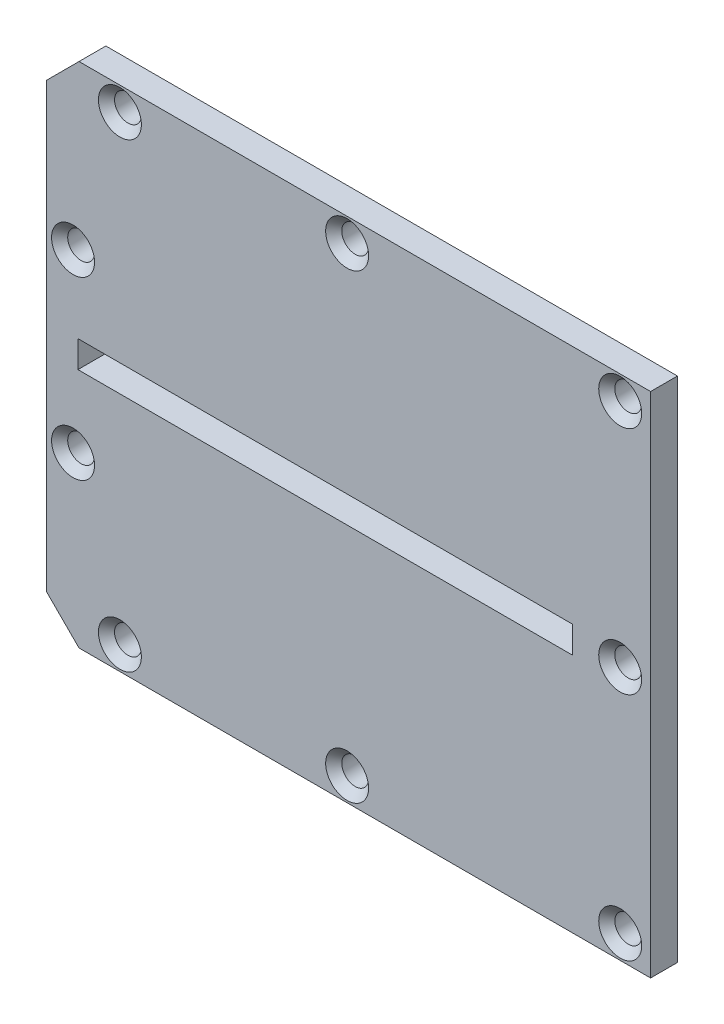
ISO-10303-21;
HEADER;
FILE_DESCRIPTION(('STEP AP214'),'2;1');
FILE_NAME('part.step','',(''),(''),'','','');
FILE_SCHEMA(('AUTOMOTIVE_DESIGN { 1 0 10303 214 1 1 1 1 }'));
ENDSEC;
DATA;
#1=APPLICATION_CONTEXT('core data for automotive mechanical design processes');
#2=APPLICATION_PROTOCOL_DEFINITION('international standard','automotive_design',2000,#1);
#3=PRODUCT_CONTEXT('',#1,'mechanical');
#4=PRODUCT('Part','Part','',(#3));
#5=PRODUCT_RELATED_PRODUCT_CATEGORY('part','',(#4));
#6=PRODUCT_DEFINITION_FORMATION('','',#4);
#7=PRODUCT_DEFINITION_CONTEXT('part definition',#1,'design');
#8=PRODUCT_DEFINITION('design','',#6,#7);
#9=PRODUCT_DEFINITION_SHAPE('','',#8);
#10=(LENGTH_UNIT() NAMED_UNIT(*) SI_UNIT(.MILLI.,.METRE.));
#11=(NAMED_UNIT(*) PLANE_ANGLE_UNIT() SI_UNIT($,.RADIAN.));
#12=(NAMED_UNIT(*) SI_UNIT($,.STERADIAN.) SOLID_ANGLE_UNIT());
#13=UNCERTAINTY_MEASURE_WITH_UNIT(LENGTH_MEASURE(1.E-05),#10,'distance_accuracy_value','');
#14=(GEOMETRIC_REPRESENTATION_CONTEXT(3) GLOBAL_UNCERTAINTY_ASSIGNED_CONTEXT((#13)) GLOBAL_UNIT_ASSIGNED_CONTEXT((#10,
#11,#12)) REPRESENTATION_CONTEXT('',''));
#15=CARTESIAN_POINT('',(0.,0.,0.));
#16=DIRECTION('',(0.,0.,1.));
#17=DIRECTION('',(1.,0.,0.));
#18=AXIS2_PLACEMENT_3D('',#15,#16,#17);
#19=CARTESIAN_POINT('',(0.,0.,2.54));
#20=DIRECTION('',(0.,0.,-1.));
#21=DIRECTION('',(-1.,0.,0.));
#22=AXIS2_PLACEMENT_3D('',#19,#20,#21);
#23=PLANE('',#22);
#24=DIRECTION('',(1.,0.,0.));
#25=VECTOR('',#24,1.);
#26=CARTESIAN_POINT('',(-104.982990789968,-1.27,2.54));
#27=LINE('',#26,#25);
#28=CARTESIAN_POINT('',(-104.982990789968,-1.27,2.54));
#29=VERTEX_POINT('',#28);
#30=CARTESIAN_POINT('',(-58.1832279844542,-1.27,2.54));
#31=VERTEX_POINT('',#30);
#32=EDGE_CURVE('E123',#29,#31,#27,.T.);
#33=ORIENTED_EDGE('',*,*,#32,.F.);
#34=DIRECTION('',(0.,-1.,0.));
#35=VECTOR('',#34,1.);
#36=CARTESIAN_POINT('',(-104.982990789968,1.27,2.54));
#37=LINE('',#36,#35);
#38=CARTESIAN_POINT('',(-104.982990789968,1.27,2.54));
#39=VERTEX_POINT('',#38);
#40=EDGE_CURVE('E50',#39,#29,#37,.T.);
#41=ORIENTED_EDGE('',*,*,#40,.F.);
#42=DIRECTION('',(-1.,0.,0.));
#43=VECTOR('',#42,1.);
#44=CARTESIAN_POINT('',(-104.982990789968,1.27,2.54));
#45=LINE('',#44,#43);
#46=CARTESIAN_POINT('',(-58.1832279844542,1.27,2.54));
#47=VERTEX_POINT('',#46);
#48=EDGE_CURVE('E129',#47,#39,#45,.T.);
#49=ORIENTED_EDGE('',*,*,#48,.F.);
#50=DIRECTION('',(0.,1.,0.));
#51=VECTOR('',#50,1.);
#52=CARTESIAN_POINT('',(-58.1832279844542,1.27,2.54));
#53=LINE('',#52,#51);
#54=EDGE_CURVE('E114',#31,#47,#53,.T.);
#55=ORIENTED_EDGE('',*,*,#54,.F.);
#56=EDGE_LOOP('',(#33,#41,#49,#55));
#57=FACE_BOUND('',#56,.T.);
#58=CARTESIAN_POINT('',(-105.440631812941,8.32011292763468,2.54));
#59=DIRECTION('',(0.,0.,-1.));
#60=DIRECTION('',(-1.,0.,0.));
#61=AXIS2_PLACEMENT_3D('',#58,#59,#60);
#62=CIRCLE('',#61,2.03199999999999);
#63=CARTESIAN_POINT('',(-107.472631812941,8.32011292763468,2.54));
#64=VERTEX_POINT('',#63);
#65=EDGE_CURVE('E236',#64,#64,#62,.T.);
#66=ORIENTED_EDGE('',*,*,#65,.T.);
#67=EDGE_LOOP('',(#66));
#68=FACE_BOUND('',#67,.T.);
#69=CARTESIAN_POINT('',(-105.440631812941,-8.32011292763468,2.54));
#70=DIRECTION('',(0.,0.,-1.));
#71=DIRECTION('',(-1.,0.,0.));
#72=AXIS2_PLACEMENT_3D('',#69,#70,#71);
#73=CIRCLE('',#72,2.03199999999999);
#74=CARTESIAN_POINT('',(-107.472631812941,-8.32011292763468,2.54));
#75=VERTEX_POINT('',#74);
#76=EDGE_CURVE('E233',#75,#75,#73,.T.);
#77=ORIENTED_EDGE('',*,*,#76,.T.);
#78=EDGE_LOOP('',(#77));
#79=FACE_BOUND('',#78,.T.);
#80=CARTESIAN_POINT('',(-101.009537175758,-21.805359872589,2.54));
#81=DIRECTION('',(0.,0.,-1.));
#82=DIRECTION('',(-1.,0.,0.));
#83=AXIS2_PLACEMENT_3D('',#80,#81,#82);
#84=CIRCLE('',#83,2.03199999999999);
#85=CARTESIAN_POINT('',(-103.041537175758,-21.805359872589,2.54));
#86=VERTEX_POINT('',#85);
#87=EDGE_CURVE('E230',#86,#86,#84,.T.);
#88=ORIENTED_EDGE('',*,*,#87,.T.);
#89=EDGE_LOOP('',(#88));
#90=FACE_BOUND('',#89,.T.);
#91=CARTESIAN_POINT('',(-79.512821609662,-21.805359872589,2.54));
#92=DIRECTION('',(0.,0.,-1.));
#93=DIRECTION('',(-1.,0.,0.));
#94=AXIS2_PLACEMENT_3D('',#91,#92,#93);
#95=CIRCLE('',#94,2.03199999999999);
#96=CARTESIAN_POINT('',(-81.544821609662,-21.805359872589,2.54));
#97=VERTEX_POINT('',#96);
#98=EDGE_CURVE('E227',#97,#97,#95,.T.);
#99=ORIENTED_EDGE('',*,*,#98,.T.);
#100=EDGE_LOOP('',(#99));
#101=FACE_BOUND('',#100,.T.);
#102=CARTESIAN_POINT('',(-53.676916466719,-21.805359872589,2.54));
#103=DIRECTION('',(0.,0.,-1.));
#104=DIRECTION('',(-1.,0.,0.));
#105=AXIS2_PLACEMENT_3D('',#102,#103,#104);
#106=CIRCLE('',#105,2.032);
#107=CARTESIAN_POINT('',(-55.708916466719,-21.805359872589,2.54));
#108=VERTEX_POINT('',#107);
#109=EDGE_CURVE('E224',#108,#108,#106,.T.);
#110=ORIENTED_EDGE('',*,*,#109,.T.);
#111=EDGE_LOOP('',(#110));
#112=FACE_BOUND('',#111,.T.);
#113=CARTESIAN_POINT('',(-53.676916466719,0.,2.54));
#114=DIRECTION('',(0.,0.,-1.));
#115=DIRECTION('',(-1.,0.,0.));
#116=AXIS2_PLACEMENT_3D('',#113,#114,#115);
#117=CIRCLE('',#116,2.032);
#118=CARTESIAN_POINT('',(-55.708916466719,0.,2.54));
#119=VERTEX_POINT('',#118);
#120=EDGE_CURVE('E221',#119,#119,#117,.T.);
#121=ORIENTED_EDGE('',*,*,#120,.T.);
#122=EDGE_LOOP('',(#121));
#123=FACE_BOUND('',#122,.T.);
#124=CARTESIAN_POINT('',(-53.676916466719,21.805359872589,2.54));
#125=DIRECTION('',(0.,0.,-1.));
#126=DIRECTION('',(-1.,0.,0.));
#127=AXIS2_PLACEMENT_3D('',#124,#125,#126);
#128=CIRCLE('',#127,2.032);
#129=CARTESIAN_POINT('',(-55.708916466719,21.805359872589,2.54));
#130=VERTEX_POINT('',#129);
#131=EDGE_CURVE('E218',#130,#130,#128,.T.);
#132=ORIENTED_EDGE('',*,*,#131,.T.);
#133=EDGE_LOOP('',(#132));
#134=FACE_BOUND('',#133,.T.);
#135=CARTESIAN_POINT('',(-79.512821609662,21.805359872589,2.54));
#136=DIRECTION('',(0.,0.,-1.));
#137=DIRECTION('',(-1.,0.,0.));
#138=AXIS2_PLACEMENT_3D('',#135,#136,#137);
#139=CIRCLE('',#138,2.03199999999999);
#140=CARTESIAN_POINT('',(-81.544821609662,21.805359872589,2.54));
#141=VERTEX_POINT('',#140);
#142=EDGE_CURVE('E215',#141,#141,#139,.T.);
#143=ORIENTED_EDGE('',*,*,#142,.T.);
#144=EDGE_LOOP('',(#143));
#145=FACE_BOUND('',#144,.T.);
#146=CARTESIAN_POINT('',(-101.009537175758,21.805359872589,2.54));
#147=DIRECTION('',(0.,0.,-1.));
#148=DIRECTION('',(-1.,0.,0.));
#149=AXIS2_PLACEMENT_3D('',#146,#147,#148);
#150=CIRCLE('',#149,2.03199999999999);
#151=CARTESIAN_POINT('',(-103.041537175758,21.805359872589,2.54));
#152=VERTEX_POINT('',#151);
#153=EDGE_CURVE('E212',#152,#152,#150,.T.);
#154=ORIENTED_EDGE('',*,*,#153,.T.);
#155=EDGE_LOOP('',(#154));
#156=FACE_BOUND('',#155,.T.);
#157=DIRECTION('',(0.707106781186548,-0.707106781186547,0.));
#158=VECTOR('',#157,1.);
#159=CARTESIAN_POINT('',(-107.95,-20.955,2.54));
#160=LINE('',#159,#158);
#161=CARTESIAN_POINT('',(-107.95,-20.955,2.54));
#162=VERTEX_POINT('',#161);
#163=CARTESIAN_POINT('',(-104.877780151956,-24.0272198480439,2.54));
#164=VERTEX_POINT('',#163);
#165=EDGE_CURVE('E166',#162,#164,#160,.T.);
#166=ORIENTED_EDGE('',*,*,#165,.T.);
#167=DIRECTION('',(1.,0.,0.));
#168=VECTOR('',#167,1.);
#169=CARTESIAN_POINT('',(-104.877780151956,-24.0272198480439,2.54));
#170=LINE('',#169,#168);
#171=CARTESIAN_POINT('',(-50.8,-24.0272198480439,2.54));
#172=VERTEX_POINT('',#171);
#173=EDGE_CURVE('E169',#164,#172,#170,.T.);
#174=ORIENTED_EDGE('',*,*,#173,.T.);
#175=DIRECTION('',(0.,1.,0.));
#176=VECTOR('',#175,1.);
#177=CARTESIAN_POINT('',(-50.8,-24.0272198480439,2.54));
#178=LINE('',#177,#176);
#179=CARTESIAN_POINT('',(-50.8,24.0272198480439,2.54));
#180=VERTEX_POINT('',#179);
#181=EDGE_CURVE('E172',#172,#180,#178,.T.);
#182=ORIENTED_EDGE('',*,*,#181,.T.);
#183=DIRECTION('',(-1.,0.,0.));
#184=VECTOR('',#183,1.);
#185=CARTESIAN_POINT('',(-50.8,24.0272198480439,2.54));
#186=LINE('',#185,#184);
#187=CARTESIAN_POINT('',(-104.877780151956,24.0272198480439,2.54));
#188=VERTEX_POINT('',#187);
#189=EDGE_CURVE('E174',#180,#188,#186,.T.);
#190=ORIENTED_EDGE('',*,*,#189,.T.);
#191=DIRECTION('',(-0.707106781186548,-0.707106781186547,0.));
#192=VECTOR('',#191,1.);
#193=CARTESIAN_POINT('',(-104.877780151956,24.0272198480439,2.54));
#194=LINE('',#193,#192);
#195=CARTESIAN_POINT('',(-107.95,20.955,2.54));
#196=VERTEX_POINT('',#195);
#197=EDGE_CURVE('E176',#188,#196,#194,.T.);
#198=ORIENTED_EDGE('',*,*,#197,.T.);
#199=DIRECTION('',(0.,-1.,0.));
#200=VECTOR('',#199,1.);
#201=CARTESIAN_POINT('',(-107.95,20.955,2.54));
#202=LINE('',#201,#200);
#203=EDGE_CURVE('E178',#196,#162,#202,.T.);
#204=ORIENTED_EDGE('',*,*,#203,.T.);
#205=EDGE_LOOP('',(#166,#174,#182,#190,#198,#204));
#206=FACE_BOUND('',#205,.T.);
#207=ADVANCED_FACE('F34',(#57,#68,#79,#90,#101,#112,#123,#134,#145,#156,#206),#23,.F.);
#208=CARTESIAN_POINT('',(0.,0.,0.));
#209=DIRECTION('',(0.,0.,-1.));
#210=DIRECTION('',(-1.,0.,0.));
#211=AXIS2_PLACEMENT_3D('',#208,#209,#210);
#212=PLANE('',#211);
#213=DIRECTION('',(0.,1.,0.));
#214=VECTOR('',#213,1.);
#215=CARTESIAN_POINT('',(-104.982990789968,0.,0.));
#216=LINE('',#215,#214);
#217=CARTESIAN_POINT('',(-104.982990789968,-1.27,0.));
#218=VERTEX_POINT('',#217);
#219=CARTESIAN_POINT('',(-104.982990789968,1.27,0.));
#220=VERTEX_POINT('',#219);
#221=EDGE_CURVE('E11',#218,#220,#216,.T.);
#222=ORIENTED_EDGE('',*,*,#221,.F.);
#223=DIRECTION('',(-1.,0.,0.));
#224=VECTOR('',#223,1.);
#225=CARTESIAN_POINT('',(0.,-1.27,0.));
#226=LINE('',#225,#224);
#227=CARTESIAN_POINT('',(-58.1832279844542,-1.27,0.));
#228=VERTEX_POINT('',#227);
#229=EDGE_CURVE('E263',#228,#218,#226,.T.);
#230=ORIENTED_EDGE('',*,*,#229,.F.);
#231=DIRECTION('',(0.,-1.,0.));
#232=VECTOR('',#231,1.);
#233=CARTESIAN_POINT('',(-58.1832279844542,0.,0.));
#234=LINE('',#233,#232);
#235=CARTESIAN_POINT('',(-58.1832279844542,1.27,0.));
#236=VERTEX_POINT('',#235);
#237=EDGE_CURVE('E117',#236,#228,#234,.T.);
#238=ORIENTED_EDGE('',*,*,#237,.F.);
#239=DIRECTION('',(1.,0.,0.));
#240=VECTOR('',#239,1.);
#241=CARTESIAN_POINT('',(0.,1.27,0.));
#242=LINE('',#241,#240);
#243=EDGE_CURVE('E43',#220,#236,#242,.T.);
#244=ORIENTED_EDGE('',*,*,#243,.F.);
#245=EDGE_LOOP('',(#222,#230,#238,#244));
#246=FACE_BOUND('',#245,.T.);
#247=CARTESIAN_POINT('',(-105.440631812941,-8.32011292763468,0.));
#248=DIRECTION('',(0.,0.,1.));
#249=DIRECTION('',(1.,0.,0.));
#250=AXIS2_PLACEMENT_3D('',#247,#248,#249);
#251=CIRCLE('',#250,1.26999999999999);
#252=CARTESIAN_POINT('',(-104.170631812941,-8.32011292763468,0.));
#253=VERTEX_POINT('',#252);
#254=EDGE_CURVE('E141',#253,#253,#251,.T.);
#255=ORIENTED_EDGE('',*,*,#254,.T.);
#256=EDGE_LOOP('',(#255));
#257=FACE_BOUND('',#256,.T.);
#258=CARTESIAN_POINT('',(-79.512821609662,-21.805359872589,0.));
#259=DIRECTION('',(0.,0.,1.));
#260=DIRECTION('',(1.,0.,0.));
#261=AXIS2_PLACEMENT_3D('',#258,#259,#260);
#262=CIRCLE('',#261,1.27);
#263=CARTESIAN_POINT('',(-78.242821609662,-21.805359872589,0.));
#264=VERTEX_POINT('',#263);
#265=EDGE_CURVE('E147',#264,#264,#262,.T.);
#266=ORIENTED_EDGE('',*,*,#265,.T.);
#267=EDGE_LOOP('',(#266));
#268=FACE_BOUND('',#267,.T.);
#269=CARTESIAN_POINT('',(-53.676916466719,0.,0.));
#270=DIRECTION('',(0.,0.,1.));
#271=DIRECTION('',(1.,0.,0.));
#272=AXIS2_PLACEMENT_3D('',#269,#270,#271);
#273=CIRCLE('',#272,1.27);
#274=CARTESIAN_POINT('',(-52.406916466719,0.,0.));
#275=VERTEX_POINT('',#274);
#276=EDGE_CURVE('E153',#275,#275,#273,.T.);
#277=ORIENTED_EDGE('',*,*,#276,.T.);
#278=EDGE_LOOP('',(#277));
#279=FACE_BOUND('',#278,.T.);
#280=CARTESIAN_POINT('',(-53.676916466719,21.805359872589,0.));
#281=DIRECTION('',(0.,0.,1.));
#282=DIRECTION('',(1.,0.,0.));
#283=AXIS2_PLACEMENT_3D('',#280,#281,#282);
#284=CIRCLE('',#283,1.27);
#285=CARTESIAN_POINT('',(-52.406916466719,21.805359872589,0.));
#286=VERTEX_POINT('',#285);
#287=EDGE_CURVE('E159',#286,#286,#284,.T.);
#288=ORIENTED_EDGE('',*,*,#287,.T.);
#289=EDGE_LOOP('',(#288));
#290=FACE_BOUND('',#289,.T.);
#291=DIRECTION('',(0.707106781186548,-0.707106781186547,0.));
#292=VECTOR('',#291,1.);
#293=CARTESIAN_POINT('',(-107.95,-20.955,0.));
#294=LINE('',#293,#292);
#295=CARTESIAN_POINT('',(-107.95,-20.955,0.));
#296=VERTEX_POINT('',#295);
#297=CARTESIAN_POINT('',(-104.877780151956,-24.0272198480439,0.));
#298=VERTEX_POINT('',#297);
#299=EDGE_CURVE('E165',#296,#298,#294,.T.);
#300=ORIENTED_EDGE('',*,*,#299,.F.);
#301=DIRECTION('',(0.,-1.,0.));
#302=VECTOR('',#301,1.);
#303=CARTESIAN_POINT('',(-107.95,20.955,0.));
#304=LINE('',#303,#302);
#305=CARTESIAN_POINT('',(-107.95,20.955,0.));
#306=VERTEX_POINT('',#305);
#307=EDGE_CURVE('E170',#306,#296,#304,.T.);
#308=ORIENTED_EDGE('',*,*,#307,.F.);
#309=DIRECTION('',(-0.707106781186548,-0.707106781186547,0.));
#310=VECTOR('',#309,1.);
#311=CARTESIAN_POINT('',(-104.877780151956,24.0272198480439,0.));
#312=LINE('',#311,#310);
#313=CARTESIAN_POINT('',(-104.877780151956,24.0272198480439,0.));
#314=VERTEX_POINT('',#313);
#315=EDGE_CURVE('E189',#314,#306,#312,.T.);
#316=ORIENTED_EDGE('',*,*,#315,.F.);
#317=DIRECTION('',(-1.,0.,0.));
#318=VECTOR('',#317,1.);
#319=CARTESIAN_POINT('',(-50.8,24.0272198480439,0.));
#320=LINE('',#319,#318);
#321=CARTESIAN_POINT('',(-50.8,24.0272198480439,0.));
#322=VERTEX_POINT('',#321);
#323=EDGE_CURVE('E187',#322,#314,#320,.T.);
#324=ORIENTED_EDGE('',*,*,#323,.F.);
#325=DIRECTION('',(0.,1.,0.));
#326=VECTOR('',#325,1.);
#327=CARTESIAN_POINT('',(-50.8,-24.0272198480439,0.));
#328=LINE('',#327,#326);
#329=CARTESIAN_POINT('',(-50.8,-24.0272198480439,0.));
#330=VERTEX_POINT('',#329);
#331=EDGE_CURVE('E185',#330,#322,#328,.T.);
#332=ORIENTED_EDGE('',*,*,#331,.F.);
#333=DIRECTION('',(1.,0.,0.));
#334=VECTOR('',#333,1.);
#335=CARTESIAN_POINT('',(-104.877780151956,-24.0272198480439,0.));
#336=LINE('',#335,#334);
#337=EDGE_CURVE('E183',#298,#330,#336,.T.);
#338=ORIENTED_EDGE('',*,*,#337,.F.);
#339=EDGE_LOOP('',(#300,#308,#316,#324,#332,#338));
#340=FACE_BOUND('',#339,.T.);
#341=CARTESIAN_POINT('',(-79.512821609662,21.805359872589,0.));
#342=DIRECTION('',(0.,0.,1.));
#343=DIRECTION('',(1.,0.,0.));
#344=AXIS2_PLACEMENT_3D('',#341,#342,#343);
#345=CIRCLE('',#344,1.26999999999999);
#346=CARTESIAN_POINT('',(-78.242821609662,21.805359872589,0.));
#347=VERTEX_POINT('',#346);
#348=EDGE_CURVE('E162',#347,#347,#345,.T.);
#349=ORIENTED_EDGE('',*,*,#348,.T.);
#350=EDGE_LOOP('',(#349));
#351=FACE_BOUND('',#350,.T.);
#352=CARTESIAN_POINT('',(-101.009537175758,21.805359872589,0.));
#353=DIRECTION('',(0.,0.,1.));
#354=DIRECTION('',(1.,0.,0.));
#355=AXIS2_PLACEMENT_3D('',#352,#353,#354);
#356=CIRCLE('',#355,1.26999999999999);
#357=CARTESIAN_POINT('',(-99.7395371757579,21.805359872589,0.));
#358=VERTEX_POINT('',#357);
#359=EDGE_CURVE('E156',#358,#358,#356,.T.);
#360=ORIENTED_EDGE('',*,*,#359,.T.);
#361=EDGE_LOOP('',(#360));
#362=FACE_BOUND('',#361,.T.);
#363=CARTESIAN_POINT('',(-53.676916466719,-21.805359872589,0.));
#364=DIRECTION('',(0.,0.,1.));
#365=DIRECTION('',(1.,0.,0.));
#366=AXIS2_PLACEMENT_3D('',#363,#364,#365);
#367=CIRCLE('',#366,1.27);
#368=CARTESIAN_POINT('',(-52.406916466719,-21.805359872589,0.));
#369=VERTEX_POINT('',#368);
#370=EDGE_CURVE('E150',#369,#369,#367,.T.);
#371=ORIENTED_EDGE('',*,*,#370,.T.);
#372=EDGE_LOOP('',(#371));
#373=FACE_BOUND('',#372,.T.);
#374=CARTESIAN_POINT('',(-101.009537175758,-21.805359872589,0.));
#375=DIRECTION('',(0.,0.,1.));
#376=DIRECTION('',(1.,0.,0.));
#377=AXIS2_PLACEMENT_3D('',#374,#375,#376);
#378=CIRCLE('',#377,1.27);
#379=CARTESIAN_POINT('',(-99.7395371757579,-21.805359872589,0.));
#380=VERTEX_POINT('',#379);
#381=EDGE_CURVE('E144',#380,#380,#378,.T.);
#382=ORIENTED_EDGE('',*,*,#381,.T.);
#383=EDGE_LOOP('',(#382));
#384=FACE_BOUND('',#383,.T.);
#385=CARTESIAN_POINT('',(-105.440631812941,8.32011292763468,0.));
#386=DIRECTION('',(0.,0.,1.));
#387=DIRECTION('',(1.,0.,0.));
#388=AXIS2_PLACEMENT_3D('',#385,#386,#387);
#389=CIRCLE('',#388,1.26999999999999);
#390=CARTESIAN_POINT('',(-104.170631812941,8.32011292763468,0.));
#391=VERTEX_POINT('',#390);
#392=EDGE_CURVE('E136',#391,#391,#389,.T.);
#393=ORIENTED_EDGE('',*,*,#392,.T.);
#394=EDGE_LOOP('',(#393));
#395=FACE_BOUND('',#394,.T.);
#396=ADVANCED_FACE('F271',(#246,#257,#268,#279,#290,#340,#351,#362,#373,#384,#395),#212,.T.);
#397=CARTESIAN_POINT('',(-107.95,-20.955,2.54));
#398=DIRECTION('',(0.707106781186547,0.707106781186548,0.));
#399=DIRECTION('',(-0.707106781186548,0.707106781186547,0.));
#400=AXIS2_PLACEMENT_3D('',#397,#398,#399);
#401=PLANE('',#400);
#402=ORIENTED_EDGE('',*,*,#299,.T.);
#403=DIRECTION('',(0.,0.,-1.));
#404=VECTOR('',#403,1.);
#405=CARTESIAN_POINT('',(-104.877780151956,-24.0272198480439,2.54));
#406=LINE('',#405,#404);
#407=EDGE_CURVE('E206',#164,#298,#406,.T.);
#408=ORIENTED_EDGE('',*,*,#407,.F.);
#409=ORIENTED_EDGE('',*,*,#165,.F.);
#410=DIRECTION('',(0.,0.,-1.));
#411=VECTOR('',#410,1.);
#412=CARTESIAN_POINT('',(-107.95,-20.955,2.54));
#413=LINE('',#412,#411);
#414=EDGE_CURVE('E180',#162,#296,#413,.T.);
#415=ORIENTED_EDGE('',*,*,#414,.T.);
#416=EDGE_LOOP('',(#402,#408,#409,#415));
#417=FACE_BOUND('',#416,.T.);
#418=ADVANCED_FACE('F290',(#417),#401,.F.);
#419=CARTESIAN_POINT('',(-104.877780151956,-24.0272198480439,2.54));
#420=DIRECTION('',(0.,1.,0.));
#421=DIRECTION('',(0.,0.,1.));
#422=AXIS2_PLACEMENT_3D('',#419,#420,#421);
#423=PLANE('',#422);
#424=ORIENTED_EDGE('',*,*,#337,.T.);
#425=DIRECTION('',(0.,0.,-1.));
#426=VECTOR('',#425,1.);
#427=CARTESIAN_POINT('',(-50.8,-24.0272198480439,2.54));
#428=LINE('',#427,#426);
#429=EDGE_CURVE('E203',#172,#330,#428,.T.);
#430=ORIENTED_EDGE('',*,*,#429,.F.);
#431=ORIENTED_EDGE('',*,*,#173,.F.);
#432=ORIENTED_EDGE('',*,*,#407,.T.);
#433=EDGE_LOOP('',(#424,#430,#431,#432));
#434=FACE_BOUND('',#433,.T.);
#435=ADVANCED_FACE('F311',(#434),#423,.F.);
#436=CARTESIAN_POINT('',(-50.8,-24.0272198480439,2.54));
#437=DIRECTION('',(-1.,0.,0.));
#438=DIRECTION('',(0.,0.,1.));
#439=AXIS2_PLACEMENT_3D('',#436,#437,#438);
#440=PLANE('',#439);
#441=ORIENTED_EDGE('',*,*,#331,.T.);
#442=DIRECTION('',(0.,0.,-1.));
#443=VECTOR('',#442,1.);
#444=CARTESIAN_POINT('',(-50.8,24.0272198480439,2.54));
#445=LINE('',#444,#443);
#446=EDGE_CURVE('E200',#180,#322,#445,.T.);
#447=ORIENTED_EDGE('',*,*,#446,.F.);
#448=ORIENTED_EDGE('',*,*,#181,.F.);
#449=ORIENTED_EDGE('',*,*,#429,.T.);
#450=EDGE_LOOP('',(#441,#447,#448,#449));
#451=FACE_BOUND('',#450,.T.);
#452=ADVANCED_FACE('F307',(#451),#440,.F.);
#453=CARTESIAN_POINT('',(-50.8,24.0272198480439,2.54));
#454=DIRECTION('',(0.,-1.,0.));
#455=DIRECTION('',(0.,0.,-1.));
#456=AXIS2_PLACEMENT_3D('',#453,#454,#455);
#457=PLANE('',#456);
#458=ORIENTED_EDGE('',*,*,#323,.T.);
#459=DIRECTION('',(0.,0.,-1.));
#460=VECTOR('',#459,1.);
#461=CARTESIAN_POINT('',(-104.877780151956,24.0272198480439,2.54));
#462=LINE('',#461,#460);
#463=EDGE_CURVE('E197',#188,#314,#462,.T.);
#464=ORIENTED_EDGE('',*,*,#463,.F.);
#465=ORIENTED_EDGE('',*,*,#189,.F.);
#466=ORIENTED_EDGE('',*,*,#446,.T.);
#467=EDGE_LOOP('',(#458,#464,#465,#466));
#468=FACE_BOUND('',#467,.T.);
#469=ADVANCED_FACE('F303',(#468),#457,.F.);
#470=CARTESIAN_POINT('',(-104.877780151956,24.0272198480439,2.54));
#471=DIRECTION('',(0.707106781186547,-0.707106781186548,0.));
#472=DIRECTION('',(0.707106781186548,0.707106781186547,0.));
#473=AXIS2_PLACEMENT_3D('',#470,#471,#472);
#474=PLANE('',#473);
#475=ORIENTED_EDGE('',*,*,#315,.T.);
#476=DIRECTION('',(0.,0.,-1.));
#477=VECTOR('',#476,1.);
#478=CARTESIAN_POINT('',(-107.95,20.955,2.54));
#479=LINE('',#478,#477);
#480=EDGE_CURVE('E194',#196,#306,#479,.T.);
#481=ORIENTED_EDGE('',*,*,#480,.F.);
#482=ORIENTED_EDGE('',*,*,#197,.F.);
#483=ORIENTED_EDGE('',*,*,#463,.T.);
#484=EDGE_LOOP('',(#475,#481,#482,#483));
#485=FACE_BOUND('',#484,.T.);
#486=ADVANCED_FACE('F299',(#485),#474,.F.);
#487=CARTESIAN_POINT('',(-107.95,20.955,2.54));
#488=DIRECTION('',(1.,0.,0.));
#489=DIRECTION('',(0.,0.,-1.));
#490=AXIS2_PLACEMENT_3D('',#487,#488,#489);
#491=PLANE('',#490);
#492=ORIENTED_EDGE('',*,*,#307,.T.);
#493=ORIENTED_EDGE('',*,*,#414,.F.);
#494=ORIENTED_EDGE('',*,*,#203,.F.);
#495=ORIENTED_EDGE('',*,*,#480,.T.);
#496=EDGE_LOOP('',(#492,#493,#494,#495));
#497=FACE_BOUND('',#496,.T.);
#498=ADVANCED_FACE('F296',(#497),#491,.F.);
#499=CARTESIAN_POINT('',(-79.512821609662,21.805359872589,2.54));
#500=DIRECTION('',(0.,0.,-1.));
#501=DIRECTION('',(-1.,0.,0.));
#502=AXIS2_PLACEMENT_3D('',#499,#500,#501);
#503=CYLINDRICAL_SURFACE('',#502,1.26999999999999);
#504=CARTESIAN_POINT('',(-79.512821609662,21.805359872589,1.77799999999999));
#505=DIRECTION('',(0.,0.,-1.));
#506=DIRECTION('',(-1.,0.,0.));
#507=AXIS2_PLACEMENT_3D('',#504,#505,#506);
#508=CIRCLE('',#507,1.26999999999999);
#509=CARTESIAN_POINT('',(-80.782821609662,21.805359872589,1.77799999999999));
#510=VERTEX_POINT('',#509);
#511=EDGE_CURVE('E257',#510,#510,#508,.F.);
#512=ORIENTED_EDGE('',*,*,#511,.T.);
#513=EDGE_LOOP('',(#512));
#514=FACE_BOUND('',#513,.T.);
#515=ORIENTED_EDGE('',*,*,#348,.F.);
#516=EDGE_LOOP('',(#515));
#517=FACE_BOUND('',#516,.T.);
#518=ADVANCED_FACE('F293',(#514,#517),#503,.F.);
#519=CARTESIAN_POINT('',(-53.676916466719,21.805359872589,2.54));
#520=DIRECTION('',(0.,0.,-1.));
#521=DIRECTION('',(-1.,0.,0.));
#522=AXIS2_PLACEMENT_3D('',#519,#520,#521);
#523=CYLINDRICAL_SURFACE('',#522,1.27);
#524=CARTESIAN_POINT('',(-53.676916466719,21.805359872589,1.778));
#525=DIRECTION('',(0.,0.,-1.));
#526=DIRECTION('',(-1.,0.,0.));
#527=AXIS2_PLACEMENT_3D('',#524,#525,#526);
#528=CIRCLE('',#527,1.27);
#529=CARTESIAN_POINT('',(-54.946916466719,21.805359872589,1.778));
#530=VERTEX_POINT('',#529);
#531=EDGE_CURVE('E254',#530,#530,#528,.F.);
#532=ORIENTED_EDGE('',*,*,#531,.T.);
#533=EDGE_LOOP('',(#532));
#534=FACE_BOUND('',#533,.T.);
#535=ORIENTED_EDGE('',*,*,#287,.F.);
#536=EDGE_LOOP('',(#535));
#537=FACE_BOUND('',#536,.T.);
#538=ADVANCED_FACE('F381',(#534,#537),#523,.F.);
#539=CARTESIAN_POINT('',(-101.009537175758,21.805359872589,2.54));
#540=DIRECTION('',(0.,0.,-1.));
#541=DIRECTION('',(-1.,0.,0.));
#542=AXIS2_PLACEMENT_3D('',#539,#540,#541);
#543=CYLINDRICAL_SURFACE('',#542,1.26999999999999);
#544=CARTESIAN_POINT('',(-101.009537175758,21.805359872589,1.77799999999999));
#545=DIRECTION('',(0.,0.,-1.));
#546=DIRECTION('',(-1.,0.,0.));
#547=AXIS2_PLACEMENT_3D('',#544,#545,#546);
#548=CIRCLE('',#547,1.26999999999999);
#549=CARTESIAN_POINT('',(-102.279537175758,21.805359872589,1.77799999999999));
#550=VERTEX_POINT('',#549);
#551=EDGE_CURVE('E260',#550,#550,#548,.F.);
#552=ORIENTED_EDGE('',*,*,#551,.T.);
#553=EDGE_LOOP('',(#552));
#554=FACE_BOUND('',#553,.T.);
#555=ORIENTED_EDGE('',*,*,#359,.F.);
#556=EDGE_LOOP('',(#555));
#557=FACE_BOUND('',#556,.T.);
#558=ADVANCED_FACE('F417',(#554,#557),#543,.F.);
#559=CARTESIAN_POINT('',(-53.676916466719,0.,2.54));
#560=DIRECTION('',(0.,0.,-1.));
#561=DIRECTION('',(-1.,0.,0.));
#562=AXIS2_PLACEMENT_3D('',#559,#560,#561);
#563=CYLINDRICAL_SURFACE('',#562,1.27);
#564=CARTESIAN_POINT('',(-53.676916466719,0.,1.77799999999999));
#565=DIRECTION('',(0.,0.,-1.));
#566=DIRECTION('',(-1.,0.,0.));
#567=AXIS2_PLACEMENT_3D('',#564,#565,#566);
#568=CIRCLE('',#567,1.27);
#569=CARTESIAN_POINT('',(-54.946916466719,0.,1.77799999999999));
#570=VERTEX_POINT('',#569);
#571=EDGE_CURVE('E251',#570,#570,#568,.F.);
#572=ORIENTED_EDGE('',*,*,#571,.T.);
#573=EDGE_LOOP('',(#572));
#574=FACE_BOUND('',#573,.T.);
#575=ORIENTED_EDGE('',*,*,#276,.F.);
#576=EDGE_LOOP('',(#575));
#577=FACE_BOUND('',#576,.T.);
#578=ADVANCED_FACE('F413',(#574,#577),#563,.F.);
#579=CARTESIAN_POINT('',(-53.676916466719,-21.805359872589,2.54));
#580=DIRECTION('',(0.,0.,-1.));
#581=DIRECTION('',(-1.,0.,0.));
#582=AXIS2_PLACEMENT_3D('',#579,#580,#581);
#583=CYLINDRICAL_SURFACE('',#582,1.27);
#584=CARTESIAN_POINT('',(-53.676916466719,-21.805359872589,1.778));
#585=DIRECTION('',(0.,0.,-1.));
#586=DIRECTION('',(-1.,0.,0.));
#587=AXIS2_PLACEMENT_3D('',#584,#585,#586);
#588=CIRCLE('',#587,1.27);
#589=CARTESIAN_POINT('',(-54.946916466719,-21.805359872589,1.778));
#590=VERTEX_POINT('',#589);
#591=EDGE_CURVE('E248',#590,#590,#588,.F.);
#592=ORIENTED_EDGE('',*,*,#591,.T.);
#593=EDGE_LOOP('',(#592));
#594=FACE_BOUND('',#593,.T.);
#595=ORIENTED_EDGE('',*,*,#370,.F.);
#596=EDGE_LOOP('',(#595));
#597=FACE_BOUND('',#596,.T.);
#598=ADVANCED_FACE('F409',(#594,#597),#583,.F.);
#599=CARTESIAN_POINT('',(-79.512821609662,-21.805359872589,2.54));
#600=DIRECTION('',(0.,0.,-1.));
#601=DIRECTION('',(-1.,0.,0.));
#602=AXIS2_PLACEMENT_3D('',#599,#600,#601);
#603=CYLINDRICAL_SURFACE('',#602,1.27);
#604=CARTESIAN_POINT('',(-79.512821609662,-21.805359872589,1.778));
#605=DIRECTION('',(0.,0.,-1.));
#606=DIRECTION('',(-1.,0.,0.));
#607=AXIS2_PLACEMENT_3D('',#604,#605,#606);
#608=CIRCLE('',#607,1.27);
#609=CARTESIAN_POINT('',(-80.7828216096621,-21.805359872589,1.778));
#610=VERTEX_POINT('',#609);
#611=EDGE_CURVE('E245',#610,#610,#608,.F.);
#612=ORIENTED_EDGE('',*,*,#611,.T.);
#613=EDGE_LOOP('',(#612));
#614=FACE_BOUND('',#613,.T.);
#615=ORIENTED_EDGE('',*,*,#265,.F.);
#616=EDGE_LOOP('',(#615));
#617=FACE_BOUND('',#616,.T.);
#618=ADVANCED_FACE('F405',(#614,#617),#603,.F.);
#619=CARTESIAN_POINT('',(-101.009537175758,-21.805359872589,2.54));
#620=DIRECTION('',(0.,0.,-1.));
#621=DIRECTION('',(-1.,0.,0.));
#622=AXIS2_PLACEMENT_3D('',#619,#620,#621);
#623=CYLINDRICAL_SURFACE('',#622,1.27);
#624=CARTESIAN_POINT('',(-101.009537175758,-21.805359872589,1.778));
#625=DIRECTION('',(0.,0.,-1.));
#626=DIRECTION('',(-1.,0.,0.));
#627=AXIS2_PLACEMENT_3D('',#624,#625,#626);
#628=CIRCLE('',#627,1.27);
#629=CARTESIAN_POINT('',(-102.279537175758,-21.805359872589,1.778));
#630=VERTEX_POINT('',#629);
#631=EDGE_CURVE('E242',#630,#630,#628,.F.);
#632=ORIENTED_EDGE('',*,*,#631,.T.);
#633=EDGE_LOOP('',(#632));
#634=FACE_BOUND('',#633,.T.);
#635=ORIENTED_EDGE('',*,*,#381,.F.);
#636=EDGE_LOOP('',(#635));
#637=FACE_BOUND('',#636,.T.);
#638=ADVANCED_FACE('F399',(#634,#637),#623,.F.);
#639=CARTESIAN_POINT('',(-105.440631812941,-8.32011292763468,2.54));
#640=DIRECTION('',(0.,0.,-1.));
#641=DIRECTION('',(-1.,0.,0.));
#642=AXIS2_PLACEMENT_3D('',#639,#640,#641);
#643=CYLINDRICAL_SURFACE('',#642,1.26999999999999);
#644=CARTESIAN_POINT('',(-105.440631812941,-8.32011292763468,1.77800000000001));
#645=DIRECTION('',(0.,0.,-1.));
#646=DIRECTION('',(-1.,0.,0.));
#647=AXIS2_PLACEMENT_3D('',#644,#645,#646);
#648=CIRCLE('',#647,1.26999999999999);
#649=CARTESIAN_POINT('',(-106.710631812941,-8.32011292763468,1.77800000000001));
#650=VERTEX_POINT('',#649);
#651=EDGE_CURVE('E239',#650,#650,#648,.F.);
#652=ORIENTED_EDGE('',*,*,#651,.T.);
#653=EDGE_LOOP('',(#652));
#654=FACE_BOUND('',#653,.T.);
#655=ORIENTED_EDGE('',*,*,#254,.F.);
#656=EDGE_LOOP('',(#655));
#657=FACE_BOUND('',#656,.T.);
#658=ADVANCED_FACE('F394',(#654,#657),#643,.F.);
#659=CARTESIAN_POINT('',(-105.440631812941,8.32011292763468,2.54));
#660=DIRECTION('',(0.,0.,-1.));
#661=DIRECTION('',(-1.,0.,0.));
#662=AXIS2_PLACEMENT_3D('',#659,#660,#661);
#663=CYLINDRICAL_SURFACE('',#662,1.26999999999999);
#664=CARTESIAN_POINT('',(-105.440631812941,8.32011292763468,1.77800000000001));
#665=DIRECTION('',(0.,0.,-1.));
#666=DIRECTION('',(-1.,0.,0.));
#667=AXIS2_PLACEMENT_3D('',#664,#665,#666);
#668=CIRCLE('',#667,1.26999999999999);
#669=CARTESIAN_POINT('',(-106.710631812941,8.32011292763468,1.77800000000001));
#670=VERTEX_POINT('',#669);
#671=EDGE_CURVE('E209',#670,#670,#668,.F.);
#672=ORIENTED_EDGE('',*,*,#671,.T.);
#673=EDGE_LOOP('',(#672));
#674=FACE_BOUND('',#673,.T.);
#675=ORIENTED_EDGE('',*,*,#392,.F.);
#676=EDGE_LOOP('',(#675));
#677=FACE_BOUND('',#676,.T.);
#678=ADVANCED_FACE('F327',(#674,#677),#663,.F.);
#679=CARTESIAN_POINT('',(-105.440631812941,8.32011292763468,1.77800000000001));
#680=DIRECTION('',(0.,0.,1.));
#681=DIRECTION('',(1.,0.,0.));
#682=AXIS2_PLACEMENT_3D('',#679,#680,#681);
#683=CONICAL_SURFACE('',#682,1.26999999999999,0.785398163397454);
#684=ORIENTED_EDGE('',*,*,#65,.F.);
#685=EDGE_LOOP('',(#684));
#686=FACE_BOUND('',#685,.T.);
#687=ORIENTED_EDGE('',*,*,#671,.F.);
#688=EDGE_LOOP('',(#687));
#689=FACE_BOUND('',#688,.T.);
#690=ADVANCED_FACE('F320',(#686,#689),#683,.F.);
#691=CARTESIAN_POINT('',(-105.440631812941,-8.32011292763468,1.77800000000001));
#692=DIRECTION('',(0.,0.,1.));
#693=DIRECTION('',(1.,0.,0.));
#694=AXIS2_PLACEMENT_3D('',#691,#692,#693);
#695=CONICAL_SURFACE('',#694,1.26999999999999,0.785398163397454);
#696=ORIENTED_EDGE('',*,*,#76,.F.);
#697=EDGE_LOOP('',(#696));
#698=FACE_BOUND('',#697,.T.);
#699=ORIENTED_EDGE('',*,*,#651,.F.);
#700=EDGE_LOOP('',(#699));
#701=FACE_BOUND('',#700,.T.);
#702=ADVANCED_FACE('F326',(#698,#701),#695,.F.);
#703=CARTESIAN_POINT('',(-101.009537175758,-21.805359872589,1.778));
#704=DIRECTION('',(0.,0.,1.));
#705=DIRECTION('',(1.,0.,0.));
#706=AXIS2_PLACEMENT_3D('',#703,#704,#705);
#707=CONICAL_SURFACE('',#706,1.27,0.785398163397441);
#708=ORIENTED_EDGE('',*,*,#87,.F.);
#709=EDGE_LOOP('',(#708));
#710=FACE_BOUND('',#709,.T.);
#711=ORIENTED_EDGE('',*,*,#631,.F.);
#712=EDGE_LOOP('',(#711));
#713=FACE_BOUND('',#712,.T.);
#714=ADVANCED_FACE('F334',(#710,#713),#707,.F.);
#715=CARTESIAN_POINT('',(-79.512821609662,-21.805359872589,1.778));
#716=DIRECTION('',(0.,0.,1.));
#717=DIRECTION('',(1.,0.,0.));
#718=AXIS2_PLACEMENT_3D('',#715,#716,#717);
#719=CONICAL_SURFACE('',#718,1.27,0.785398163397441);
#720=ORIENTED_EDGE('',*,*,#98,.F.);
#721=EDGE_LOOP('',(#720));
#722=FACE_BOUND('',#721,.T.);
#723=ORIENTED_EDGE('',*,*,#611,.F.);
#724=EDGE_LOOP('',(#723));
#725=FACE_BOUND('',#724,.T.);
#726=ADVANCED_FACE('F341',(#722,#725),#719,.F.);
#727=CARTESIAN_POINT('',(-53.676916466719,-21.805359872589,1.77799999999999));
#728=DIRECTION('',(0.,0.,1.));
#729=DIRECTION('',(1.,0.,0.));
#730=AXIS2_PLACEMENT_3D('',#727,#728,#729);
#731=CONICAL_SURFACE('',#730,1.27,0.785398163397446);
#732=ORIENTED_EDGE('',*,*,#109,.F.);
#733=EDGE_LOOP('',(#732));
#734=FACE_BOUND('',#733,.T.);
#735=ORIENTED_EDGE('',*,*,#591,.F.);
#736=EDGE_LOOP('',(#735));
#737=FACE_BOUND('',#736,.T.);
#738=ADVANCED_FACE('F348',(#734,#737),#731,.F.);
#739=CARTESIAN_POINT('',(-53.676916466719,0.,1.77799999999999));
#740=DIRECTION('',(0.,0.,1.));
#741=DIRECTION('',(1.,0.,0.));
#742=AXIS2_PLACEMENT_3D('',#739,#740,#741);
#743=CONICAL_SURFACE('',#742,1.27,0.785398163397446);
#744=ORIENTED_EDGE('',*,*,#120,.F.);
#745=EDGE_LOOP('',(#744));
#746=FACE_BOUND('',#745,.T.);
#747=ORIENTED_EDGE('',*,*,#571,.F.);
#748=EDGE_LOOP('',(#747));
#749=FACE_BOUND('',#748,.T.);
#750=ADVANCED_FACE('F355',(#746,#749),#743,.F.);
#751=CARTESIAN_POINT('',(-53.676916466719,21.805359872589,1.77799999999999));
#752=DIRECTION('',(0.,0.,1.));
#753=DIRECTION('',(1.,0.,0.));
#754=AXIS2_PLACEMENT_3D('',#751,#752,#753);
#755=CONICAL_SURFACE('',#754,1.27,0.785398163397446);
#756=ORIENTED_EDGE('',*,*,#131,.F.);
#757=EDGE_LOOP('',(#756));
#758=FACE_BOUND('',#757,.T.);
#759=ORIENTED_EDGE('',*,*,#531,.F.);
#760=EDGE_LOOP('',(#759));
#761=FACE_BOUND('',#760,.T.);
#762=ADVANCED_FACE('F362',(#758,#761),#755,.F.);
#763=CARTESIAN_POINT('',(-79.512821609662,21.805359872589,1.77799999999999));
#764=DIRECTION('',(0.,0.,1.));
#765=DIRECTION('',(1.,0.,0.));
#766=AXIS2_PLACEMENT_3D('',#763,#764,#765);
#767=CONICAL_SURFACE('',#766,1.26999999999999,0.785398163397441);
#768=ORIENTED_EDGE('',*,*,#142,.F.);
#769=EDGE_LOOP('',(#768));
#770=FACE_BOUND('',#769,.T.);
#771=ORIENTED_EDGE('',*,*,#511,.F.);
#772=EDGE_LOOP('',(#771));
#773=FACE_BOUND('',#772,.T.);
#774=ADVANCED_FACE('F281',(#770,#773),#767,.F.);
#775=CARTESIAN_POINT('',(-101.009537175758,21.805359872589,1.77799999999999));
#776=DIRECTION('',(0.,0.,1.));
#777=DIRECTION('',(1.,0.,0.));
#778=AXIS2_PLACEMENT_3D('',#775,#776,#777);
#779=CONICAL_SURFACE('',#778,1.26999999999999,0.785398163397441);
#780=ORIENTED_EDGE('',*,*,#153,.F.);
#781=EDGE_LOOP('',(#780));
#782=FACE_BOUND('',#781,.T.);
#783=ORIENTED_EDGE('',*,*,#551,.F.);
#784=EDGE_LOOP('',(#783));
#785=FACE_BOUND('',#784,.T.);
#786=ADVANCED_FACE('F37',(#782,#785),#779,.F.);
#787=CARTESIAN_POINT('',(-104.982990789968,1.27,-2.794));
#788=DIRECTION('',(-1.,0.,0.));
#789=DIRECTION('',(0.,0.,1.));
#790=AXIS2_PLACEMENT_3D('',#787,#788,#789);
#791=PLANE('',#790);
#792=ORIENTED_EDGE('',*,*,#221,.T.);
#793=DIRECTION('',(0.,0.,1.));
#794=VECTOR('',#793,1.);
#795=CARTESIAN_POINT('',(-104.982990789968,1.27,-2.794));
#796=LINE('',#795,#794);
#797=EDGE_CURVE('E134',#220,#39,#796,.T.);
#798=ORIENTED_EDGE('',*,*,#797,.T.);
#799=ORIENTED_EDGE('',*,*,#40,.T.);
#800=DIRECTION('',(0.,0.,1.));
#801=VECTOR('',#800,1.);
#802=CARTESIAN_POINT('',(-104.982990789968,-1.27,-2.794));
#803=LINE('',#802,#801);
#804=EDGE_CURVE('E120',#218,#29,#803,.T.);
#805=ORIENTED_EDGE('',*,*,#804,.F.);
#806=EDGE_LOOP('',(#792,#798,#799,#805));
#807=FACE_BOUND('',#806,.T.);
#808=ADVANCED_FACE('F273',(#807),#791,.F.);
#809=CARTESIAN_POINT('',(-104.982990789968,1.27,-2.794));
#810=DIRECTION('',(0.,1.,0.));
#811=DIRECTION('',(0.,0.,1.));
#812=AXIS2_PLACEMENT_3D('',#809,#810,#811);
#813=PLANE('',#812);
#814=ORIENTED_EDGE('',*,*,#243,.T.);
#815=DIRECTION('',(0.,0.,1.));
#816=VECTOR('',#815,1.);
#817=CARTESIAN_POINT('',(-58.1832279844542,1.27,-2.794));
#818=LINE('',#817,#816);
#819=EDGE_CURVE('E119',#236,#47,#818,.T.);
#820=ORIENTED_EDGE('',*,*,#819,.T.);
#821=ORIENTED_EDGE('',*,*,#48,.T.);
#822=ORIENTED_EDGE('',*,*,#797,.F.);
#823=EDGE_LOOP('',(#814,#820,#821,#822));
#824=FACE_BOUND('',#823,.T.);
#825=ADVANCED_FACE('F268',(#824),#813,.F.);
#826=CARTESIAN_POINT('',(-58.1832279844542,1.27,-2.794));
#827=DIRECTION('',(1.,0.,0.));
#828=DIRECTION('',(0.,0.,-1.));
#829=AXIS2_PLACEMENT_3D('',#826,#827,#828);
#830=PLANE('',#829);
#831=ORIENTED_EDGE('',*,*,#237,.T.);
#832=DIRECTION('',(0.,0.,1.));
#833=VECTOR('',#832,1.);
#834=CARTESIAN_POINT('',(-58.1832279844542,-1.27,-2.794));
#835=LINE('',#834,#833);
#836=EDGE_CURVE('E58',#228,#31,#835,.T.);
#837=ORIENTED_EDGE('',*,*,#836,.T.);
#838=ORIENTED_EDGE('',*,*,#54,.T.);
#839=ORIENTED_EDGE('',*,*,#819,.F.);
#840=EDGE_LOOP('',(#831,#837,#838,#839));
#841=FACE_BOUND('',#840,.T.);
#842=ADVANCED_FACE('F111',(#841),#830,.F.);
#843=CARTESIAN_POINT('',(-104.982990789968,-1.27,-2.794));
#844=DIRECTION('',(0.,-1.,0.));
#845=DIRECTION('',(0.,0.,-1.));
#846=AXIS2_PLACEMENT_3D('',#843,#844,#845);
#847=PLANE('',#846);
#848=ORIENTED_EDGE('',*,*,#229,.T.);
#849=ORIENTED_EDGE('',*,*,#804,.T.);
#850=ORIENTED_EDGE('',*,*,#32,.T.);
#851=ORIENTED_EDGE('',*,*,#836,.F.);
#852=EDGE_LOOP('',(#848,#849,#850,#851));
#853=FACE_BOUND('',#852,.T.);
#854=ADVANCED_FACE('F124',(#853),#847,.F.);
#855=CLOSED_SHELL('',(#207,#396,#418,#435,#452,#469,#486,#498,#518,#538,#558,#578,#598,#618,
#638,#658,#678,#690,#702,#714,#726,#738,#750,#762,#774,#786,#808,#825,#842,#854));
#856=MANIFOLD_SOLID_BREP('B2',#855);
#857=ADVANCED_BREP_SHAPE_REPRESENTATION('',(#18,#856),#14);
#858=SHAPE_DEFINITION_REPRESENTATION(#9,#857);
ENDSEC;
END-ISO-10303-21;
